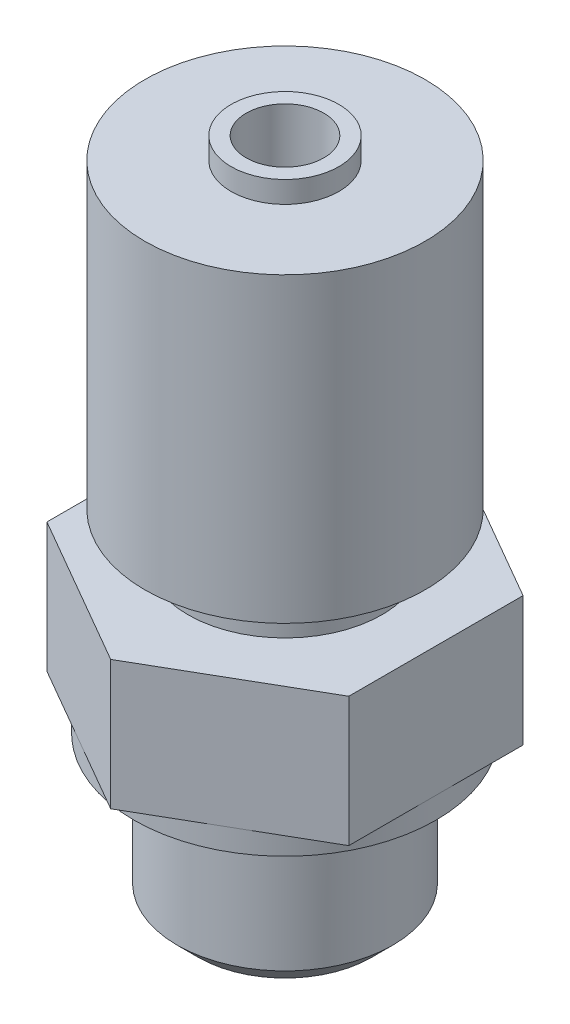
ISO-10303-21;
HEADER;
FILE_DESCRIPTION(('STEP AP214'),'2;1');
FILE_NAME('part.step','',(''),(''),'','','');
FILE_SCHEMA(('AUTOMOTIVE_DESIGN { 1 0 10303 214 1 1 1 1 }'));
ENDSEC;
DATA;
#1=APPLICATION_CONTEXT('core data for automotive mechanical design processes');
#2=APPLICATION_PROTOCOL_DEFINITION('international standard','automotive_design',2000,#1);
#3=PRODUCT_CONTEXT('',#1,'mechanical');
#4=PRODUCT('Part','Part','',(#3));
#5=PRODUCT_RELATED_PRODUCT_CATEGORY('part','',(#4));
#6=PRODUCT_DEFINITION_FORMATION('','',#4);
#7=PRODUCT_DEFINITION_CONTEXT('part definition',#1,'design');
#8=PRODUCT_DEFINITION('design','',#6,#7);
#9=PRODUCT_DEFINITION_SHAPE('','',#8);
#10=(LENGTH_UNIT() NAMED_UNIT(*) SI_UNIT(.MILLI.,.METRE.));
#11=(NAMED_UNIT(*) PLANE_ANGLE_UNIT() SI_UNIT($,.RADIAN.));
#12=(NAMED_UNIT(*) SI_UNIT($,.STERADIAN.) SOLID_ANGLE_UNIT());
#13=UNCERTAINTY_MEASURE_WITH_UNIT(LENGTH_MEASURE(1.E-05),#10,'distance_accuracy_value','');
#14=(GEOMETRIC_REPRESENTATION_CONTEXT(3) GLOBAL_UNCERTAINTY_ASSIGNED_CONTEXT((#13)) GLOBAL_UNIT_ASSIGNED_CONTEXT((#10,
#11,#12)) REPRESENTATION_CONTEXT('',''));
#15=CARTESIAN_POINT('',(0.,0.,0.));
#16=DIRECTION('',(0.,0.,1.));
#17=DIRECTION('',(1.,0.,0.));
#18=AXIS2_PLACEMENT_3D('',#15,#16,#17);
#19=CARTESIAN_POINT('',(0.,15.5,0.));
#20=DIRECTION('',(0.,1.,0.));
#21=DIRECTION('',(0.,0.,1.));
#22=AXIS2_PLACEMENT_3D('',#19,#20,#21);
#23=CYLINDRICAL_SURFACE('',#22,1.25);
#24=CARTESIAN_POINT('',(0.,15.5,0.));
#25=DIRECTION('',(0.,1.,0.));
#26=DIRECTION('',(0.,0.,1.));
#27=AXIS2_PLACEMENT_3D('',#24,#25,#26);
#28=CIRCLE('',#27,1.25);
#29=CARTESIAN_POINT('',(0.,15.5,1.25));
#30=VERTEX_POINT('',#29);
#31=EDGE_CURVE('E390',#30,#30,#28,.T.);
#32=ORIENTED_EDGE('',*,*,#31,.F.);
#33=EDGE_LOOP('',(#32));
#34=FACE_BOUND('',#33,.T.);
#35=CARTESIAN_POINT('',(0.,15.,0.));
#36=DIRECTION('',(0.,1.,0.));
#37=DIRECTION('',(0.,0.,1.));
#38=AXIS2_PLACEMENT_3D('',#35,#36,#37);
#39=CIRCLE('',#38,1.25);
#40=CARTESIAN_POINT('',(0.,15.,1.25));
#41=VERTEX_POINT('',#40);
#42=EDGE_CURVE('E19',#41,#41,#39,.F.);
#43=ORIENTED_EDGE('',*,*,#42,.F.);
#44=EDGE_LOOP('',(#43));
#45=FACE_BOUND('',#44,.T.);
#46=ADVANCED_FACE('F16',(#34,#45),#23,.T.);
#47=CARTESIAN_POINT('',(-3.25,15.,3.28900212066227));
#48=DIRECTION('',(0.,1.,0.));
#49=DIRECTION('',(1.,0.,0.));
#50=AXIS2_PLACEMENT_3D('',#47,#48,#49);
#51=PLANE('',#50);
#52=ORIENTED_EDGE('',*,*,#42,.T.);
#53=EDGE_LOOP('',(#52));
#54=FACE_BOUND('',#53,.T.);
#55=CARTESIAN_POINT('',(0.,15.,0.));
#56=DIRECTION('',(0.,1.,0.));
#57=DIRECTION('',(0.,0.,1.));
#58=AXIS2_PLACEMENT_3D('',#55,#56,#57);
#59=CIRCLE('',#58,3.25);
#60=CARTESIAN_POINT('',(0.,15.,3.25));
#61=VERTEX_POINT('',#60);
#62=EDGE_CURVE('E388',#61,#61,#59,.F.);
#63=ORIENTED_EDGE('',*,*,#62,.F.);
#64=EDGE_LOOP('',(#63));
#65=FACE_BOUND('',#64,.T.);
#66=ADVANCED_FACE('F256',(#54,#65),#51,.T.);
#67=CARTESIAN_POINT('',(-1.25,15.5,1.26500421623099));
#68=DIRECTION('',(0.,1.,0.));
#69=DIRECTION('',(1.,0.,0.));
#70=AXIS2_PLACEMENT_3D('',#67,#68,#69);
#71=PLANE('',#70);
#72=CARTESIAN_POINT('',(0.,15.5,0.));
#73=DIRECTION('',(0.,1.,0.));
#74=DIRECTION('',(0.,0.,1.));
#75=AXIS2_PLACEMENT_3D('',#72,#73,#74);
#76=CIRCLE('',#75,0.9);
#77=CARTESIAN_POINT('',(0.,15.5,0.9));
#78=VERTEX_POINT('',#77);
#79=EDGE_CURVE('E385',#78,#78,#76,.T.);
#80=ORIENTED_EDGE('',*,*,#79,.F.);
#81=EDGE_LOOP('',(#80));
#82=FACE_BOUND('',#81,.T.);
#83=ORIENTED_EDGE('',*,*,#31,.T.);
#84=EDGE_LOOP('',(#83));
#85=FACE_BOUND('',#84,.T.);
#86=ADVANCED_FACE('F253',(#82,#85),#71,.T.);
#87=CARTESIAN_POINT('',(0.,15.,0.));
#88=DIRECTION('',(0.,1.,0.));
#89=DIRECTION('',(0.,0.,1.));
#90=AXIS2_PLACEMENT_3D('',#87,#88,#89);
#91=CYLINDRICAL_SURFACE('',#90,3.25);
#92=ORIENTED_EDGE('',*,*,#62,.T.);
#93=EDGE_LOOP('',(#92));
#94=FACE_BOUND('',#93,.T.);
#95=CARTESIAN_POINT('',(0.,8.,0.));
#96=DIRECTION('',(0.,1.,0.));
#97=DIRECTION('',(0.,0.,1.));
#98=AXIS2_PLACEMENT_3D('',#95,#96,#97);
#99=CIRCLE('',#98,3.25);
#100=CARTESIAN_POINT('',(0.,8.,3.25));
#101=VERTEX_POINT('',#100);
#102=EDGE_CURVE('E382',#101,#101,#99,.F.);
#103=ORIENTED_EDGE('',*,*,#102,.F.);
#104=EDGE_LOOP('',(#103));
#105=FACE_BOUND('',#104,.T.);
#106=ADVANCED_FACE('F249',(#94,#105),#91,.T.);
#107=CARTESIAN_POINT('',(0.,0.,0.));
#108=DIRECTION('',(0.,1.,0.));
#109=DIRECTION('',(0.,0.,1.));
#110=AXIS2_PLACEMENT_3D('',#107,#108,#109);
#111=CYLINDRICAL_SURFACE('',#110,0.9);
#112=CARTESIAN_POINT('',(0.,0.,0.));
#113=DIRECTION('',(0.,1.,0.));
#114=DIRECTION('',(0.,0.,1.));
#115=AXIS2_PLACEMENT_3D('',#112,#113,#114);
#116=CIRCLE('',#115,0.9);
#117=CARTESIAN_POINT('',(0.,0.,0.9));
#118=VERTEX_POINT('',#117);
#119=EDGE_CURVE('E379',#118,#118,#116,.T.);
#120=ORIENTED_EDGE('',*,*,#119,.F.);
#121=EDGE_LOOP('',(#120));
#122=FACE_BOUND('',#121,.T.);
#123=ORIENTED_EDGE('',*,*,#79,.T.);
#124=EDGE_LOOP('',(#123));
#125=FACE_BOUND('',#124,.T.);
#126=ADVANCED_FACE('F245',(#122,#125),#111,.F.);
#127=CARTESIAN_POINT('',(3.25,8.,3.289002120661));
#128=DIRECTION('',(0.,-1.,0.));
#129=DIRECTION('',(-1.,0.,0.));
#130=AXIS2_PLACEMENT_3D('',#127,#128,#129);
#131=PLANE('',#130);
#132=CARTESIAN_POINT('',(0.,8.,0.));
#133=DIRECTION('',(0.,1.,0.));
#134=DIRECTION('',(0.,0.,1.));
#135=AXIS2_PLACEMENT_3D('',#132,#133,#134);
#136=CIRCLE('',#135,2.25);
#137=CARTESIAN_POINT('',(0.,8.,2.25));
#138=VERTEX_POINT('',#137);
#139=EDGE_CURVE('E376',#138,#138,#136,.F.);
#140=ORIENTED_EDGE('',*,*,#139,.F.);
#141=EDGE_LOOP('',(#140));
#142=FACE_BOUND('',#141,.T.);
#143=ORIENTED_EDGE('',*,*,#102,.T.);
#144=EDGE_LOOP('',(#143));
#145=FACE_BOUND('',#144,.T.);
#146=ADVANCED_FACE('F241',(#142,#145),#131,.T.);
#147=CARTESIAN_POINT('',(2.01,0.,2.03412212055392));
#148=DIRECTION('',(0.,-1.,0.));
#149=DIRECTION('',(-1.,0.,0.));
#150=AXIS2_PLACEMENT_3D('',#147,#148,#149);
#151=PLANE('',#150);
#152=ORIENTED_EDGE('',*,*,#119,.T.);
#153=EDGE_LOOP('',(#152));
#154=FACE_BOUND('',#153,.T.);
#155=CARTESIAN_POINT('',(0.,0.,0.));
#156=DIRECTION('',(0.,1.,0.));
#157=DIRECTION('',(0.,0.,1.));
#158=AXIS2_PLACEMENT_3D('',#155,#156,#157);
#159=CIRCLE('',#158,2.01);
#160=CARTESIAN_POINT('',(0.,0.,2.01));
#161=VERTEX_POINT('',#160);
#162=EDGE_CURVE('E371',#161,#161,#159,.T.);
#163=ORIENTED_EDGE('',*,*,#162,.F.);
#164=EDGE_LOOP('',(#163));
#165=FACE_BOUND('',#164,.T.);
#166=ADVANCED_FACE('F237',(#154,#165),#151,.T.);
#167=CARTESIAN_POINT('',(0.,8.,0.));
#168=DIRECTION('',(0.,1.,0.));
#169=DIRECTION('',(0.,0.,1.));
#170=AXIS2_PLACEMENT_3D('',#167,#168,#169);
#171=CYLINDRICAL_SURFACE('',#170,2.25);
#172=CARTESIAN_POINT('',(0.,7.,0.));
#173=DIRECTION('',(0.,1.,0.));
#174=DIRECTION('',(0.,0.,1.));
#175=AXIS2_PLACEMENT_3D('',#172,#173,#174);
#176=CIRCLE('',#175,2.25);
#177=CARTESIAN_POINT('',(0.,7.,2.25));
#178=VERTEX_POINT('',#177);
#179=EDGE_CURVE('E184',#178,#178,#176,.F.);
#180=ORIENTED_EDGE('',*,*,#179,.F.);
#181=EDGE_LOOP('',(#180));
#182=FACE_BOUND('',#181,.T.);
#183=ORIENTED_EDGE('',*,*,#139,.T.);
#184=EDGE_LOOP('',(#183));
#185=FACE_BOUND('',#184,.T.);
#186=ADVANCED_FACE('F232',(#182,#185),#171,.T.);
#187=CARTESIAN_POINT('',(-1.75,4.,4.0515555140382));
#188=CARTESIAN_POINT('',(-1.75,4.,4.04145188432738));
#189=CARTESIAN_POINT('',(-1.75,4.,3.03108891324553));
#190=B_SPLINE_CURVE_WITH_KNOTS('',1,(#187,#188,#189),.UNSPECIFIED.,.F.,.F.,(2,1,2),(-0.01,0.,
1.),.UNSPECIFIED.);
#191=DIRECTION('',(1.,0.,0.));
#192=VECTOR('',#191,1.);
#193=SURFACE_OF_LINEAR_EXTRUSION('',#190,#192);
#194=DIRECTION('',(0.866025403784439,0.,-0.5));
#195=VECTOR('',#194,1.);
#196=CARTESIAN_POINT('',(1.75,4.,3.03108891324554));
#197=LINE('',#196,#195);
#198=CARTESIAN_POINT('',(0.,4.,4.04145188432738));
#199=VERTEX_POINT('',#198);
#200=CARTESIAN_POINT('',(1.7503904492022,4.,3.03086348729354));
#201=VERTEX_POINT('',#200);
#202=EDGE_CURVE('E221',#199,#201,#197,.T.);
#203=ORIENTED_EDGE('',*,*,#202,.F.);
#204=DIRECTION('',(0.866025403784439,0.,0.5));
#205=VECTOR('',#204,1.);
#206=CARTESIAN_POINT('',(-1.75,4.,3.03108891324554));
#207=LINE('',#206,#205);
#208=CARTESIAN_POINT('',(-1.75039045907652,4.,3.03086341451837));
#209=VERTEX_POINT('',#208);
#210=EDGE_CURVE('E370',#209,#199,#207,.T.);
#211=ORIENTED_EDGE('',*,*,#210,.F.);
#212=CARTESIAN_POINT('',(0.,4.,0.));
#213=DIRECTION('',(0.,1.,0.));
#214=DIRECTION('',(0.,0.,1.));
#215=AXIS2_PLACEMENT_3D('',#212,#213,#214);
#216=CIRCLE('',#215,3.5);
#217=EDGE_CURVE('E94',#201,#209,#216,.F.);
#218=ORIENTED_EDGE('',*,*,#217,.F.);
#219=EDGE_LOOP('',(#203,#211,#218));
#220=FACE_BOUND('',#219,.T.);
#221=ADVANCED_FACE('F227',(#220),#193,.T.);
#222=CARTESIAN_POINT('',(0.,0.,0.));
#223=DIRECTION('',(0.,1.,0.));
#224=DIRECTION('',(0.,0.,1.));
#225=AXIS2_PLACEMENT_3D('',#222,#223,#224);
#226=CONICAL_SURFACE('',#225,2.01,0.785398163397449);
#227=CARTESIAN_POINT('',(0.,0.49,0.));
#228=DIRECTION('',(0.,1.,0.));
#229=DIRECTION('',(1.,0.,0.));
#230=AXIS2_PLACEMENT_3D('',#227,#228,#229);
#231=CIRCLE('',#230,2.5);
#232=CARTESIAN_POINT('',(2.5,0.49,0.));
#233=VERTEX_POINT('',#232);
#234=EDGE_CURVE('E208',#233,#233,#231,.T.);
#235=ORIENTED_EDGE('',*,*,#234,.F.);
#236=EDGE_LOOP('',(#235));
#237=FACE_BOUND('',#236,.T.);
#238=ORIENTED_EDGE('',*,*,#162,.T.);
#239=EDGE_LOOP('',(#238));
#240=FACE_BOUND('',#239,.T.);
#241=ADVANCED_FACE('F231',(#237,#240),#226,.T.);
#242=CARTESIAN_POINT('',(-3.5,4.,3.03108891324554));
#243=DIRECTION('',(0.,-1.,0.));
#244=DIRECTION('',(0.,0.,-1.));
#245=AXIS2_PLACEMENT_3D('',#242,#243,#244);
#246=PLANE('',#245);
#247=DIRECTION('',(0.866025403784438,0.,0.5));
#248=VECTOR('',#247,1.);
#249=CARTESIAN_POINT('',(-3.5,4.,2.02072594216369));
#250=LINE('',#249,#248);
#251=CARTESIAN_POINT('',(-3.5,4.,2.02072594216369));
#252=VERTEX_POINT('',#251);
#253=EDGE_CURVE('E367',#252,#209,#250,.T.);
#254=ORIENTED_EDGE('',*,*,#253,.F.);
#255=DIRECTION('',(0.,0.,1.));
#256=VECTOR('',#255,1.);
#257=CARTESIAN_POINT('',(-3.5,4.,0.));
#258=LINE('',#257,#256);
#259=CARTESIAN_POINT('',(-3.5,4.,0.));
#260=VERTEX_POINT('',#259);
#261=EDGE_CURVE('E143',#260,#252,#258,.T.);
#262=ORIENTED_EDGE('',*,*,#261,.F.);
#263=CARTESIAN_POINT('',(0.,4.,0.));
#264=DIRECTION('',(0.,1.,0.));
#265=DIRECTION('',(0.,0.,1.));
#266=AXIS2_PLACEMENT_3D('',#263,#264,#265);
#267=CIRCLE('',#266,3.5);
#268=EDGE_CURVE('E216',#209,#260,#267,.F.);
#269=ORIENTED_EDGE('',*,*,#268,.F.);
#270=EDGE_LOOP('',(#254,#262,#269));
#271=FACE_BOUND('',#270,.T.);
#272=ADVANCED_FACE('F407',(#271),#246,.T.);
#273=CARTESIAN_POINT('',(-3.5,4.,2.02072594216369));
#274=DIRECTION('',(-0.5,0.,0.866025403784438));
#275=DIRECTION('',(0.866025403784438,0.,0.5));
#276=AXIS2_PLACEMENT_3D('',#273,#274,#275);
#277=PLANE('',#276);
#278=ORIENTED_EDGE('',*,*,#210,.T.);
#279=DIRECTION('',(0.,1.,0.));
#280=VECTOR('',#279,1.);
#281=CARTESIAN_POINT('',(0.,4.,4.04145188432738));
#282=LINE('',#281,#280);
#283=CARTESIAN_POINT('',(-8.33414995002335E-08,7.,4.04145183621014));
#284=VERTEX_POINT('',#283);
#285=EDGE_CURVE('E183',#284,#199,#282,.F.);
#286=ORIENTED_EDGE('',*,*,#285,.F.);
#287=CARTESIAN_POINT('',(-3.5,7.,2.02072594216369));
#288=CARTESIAN_POINT('',(-3.35416666666667,7.,2.10492285642051));
#289=CARTESIAN_POINT('',(-3.20833333333333,7.,2.18911977067733));
#290=CARTESIAN_POINT('',(-2.91666666666667,7.,2.35751359919097));
#291=CARTESIAN_POINT('',(-2.77083333333333,7.,2.44171051344779));
#292=CARTESIAN_POINT('',(-2.47916666666667,7.,2.61010434196143));
#293=CARTESIAN_POINT('',(-2.33333333333333,7.,2.69430125621825));
#294=CARTESIAN_POINT('',(-2.04166666666667,7.,2.86269508473189));
#295=CARTESIAN_POINT('',(-1.89583333333333,7.,2.94689199898872));
#296=CARTESIAN_POINT('',(-1.60416666666667,7.,3.11528582750236));
#297=CARTESIAN_POINT('',(-1.45833333333333,7.,3.19948274175918));
#298=CARTESIAN_POINT('',(-1.16666666666667,7.,3.36787657027282));
#299=CARTESIAN_POINT('',(-1.02083333333333,7.,3.45207348452964));
#300=CARTESIAN_POINT('',(-0.729166666666667,7.,3.62046731304328));
#301=CARTESIAN_POINT('',(-0.583333333333333,7.,3.7046642273001));
#302=CARTESIAN_POINT('',(-0.291666666666667,7.,3.87305805581374));
#303=CARTESIAN_POINT('',(-0.145833333333333,7.,3.95725497007056));
#304=CARTESIAN_POINT('',(0.,7.,4.04145188432738));
#305=B_SPLINE_CURVE_WITH_KNOTS('',3,(#287,#288,#289,#290,#291,#292,#293,#294,#295,#296,#297,
#298,#299,#300,#301,#302,#303,#304),.UNSPECIFIED.,.F.,.F.,(4,2,2,2,2,2,2,2,4),(0.,
0.505181485540922,1.01036297108184,1.51554445662277,2.02072594216369,2.52590742770461,
3.03108891324554,3.53627039878646,4.04145188432738),.UNSPECIFIED.);
#306=CARTESIAN_POINT('',(-3.5,7.,2.02072594216369));
#307=VERTEX_POINT('',#306);
#308=EDGE_CURVE('E206',#307,#284,#305,.T.);
#309=ORIENTED_EDGE('',*,*,#308,.F.);
#310=DIRECTION('',(0.,1.,0.));
#311=VECTOR('',#310,1.);
#312=CARTESIAN_POINT('',(-3.5,4.,2.02072594216369));
#313=LINE('',#312,#311);
#314=EDGE_CURVE('E146',#252,#307,#313,.T.);
#315=ORIENTED_EDGE('',*,*,#314,.F.);
#316=ORIENTED_EDGE('',*,*,#253,.T.);
#317=EDGE_LOOP('',(#278,#286,#309,#315,#316));
#318=FACE_BOUND('',#317,.T.);
#319=ADVANCED_FACE('F412',(#318),#277,.T.);
#320=CARTESIAN_POINT('',(-3.5,7.,-4.04145188432738));
#321=DIRECTION('',(0.,1.,0.));
#322=DIRECTION('',(0.,0.,1.));
#323=AXIS2_PLACEMENT_3D('',#320,#321,#322);
#324=PLANE('',#323);
#325=ORIENTED_EDGE('',*,*,#179,.T.);
#326=EDGE_LOOP('',(#325));
#327=FACE_BOUND('',#326,.T.);
#328=DIRECTION('',(0.,0.,1.));
#329=VECTOR('',#328,1.);
#330=CARTESIAN_POINT('',(3.5,7.,0.));
#331=LINE('',#330,#329);
#332=CARTESIAN_POINT('',(3.5,7.,-2.02072594216369));
#333=VERTEX_POINT('',#332);
#334=CARTESIAN_POINT('',(3.5,7.,2.02072594216369));
#335=VERTEX_POINT('',#334);
#336=EDGE_CURVE('E119',#333,#335,#331,.T.);
#337=ORIENTED_EDGE('',*,*,#336,.F.);
#338=DIRECTION('',(0.866025403784439,0.,0.5));
#339=VECTOR('',#338,1.);
#340=CARTESIAN_POINT('',(1.75,7.,-3.03108891324554));
#341=LINE('',#340,#339);
#342=CARTESIAN_POINT('',(0.,7.,-4.04145188432738));
#343=VERTEX_POINT('',#342);
#344=EDGE_CURVE('E134',#343,#333,#341,.T.);
#345=ORIENTED_EDGE('',*,*,#344,.F.);
#346=DIRECTION('',(0.866025403784439,0.,-0.5));
#347=VECTOR('',#346,1.);
#348=CARTESIAN_POINT('',(-1.75,7.,-3.03108891324554));
#349=LINE('',#348,#347);
#350=CARTESIAN_POINT('',(-3.5,7.,-2.02072594216369));
#351=VERTEX_POINT('',#350);
#352=EDGE_CURVE('E140',#351,#343,#349,.T.);
#353=ORIENTED_EDGE('',*,*,#352,.F.);
#354=DIRECTION('',(0.,0.,-1.));
#355=VECTOR('',#354,1.);
#356=CARTESIAN_POINT('',(-3.5,7.,0.));
#357=LINE('',#356,#355);
#358=EDGE_CURVE('E147',#307,#351,#357,.T.);
#359=ORIENTED_EDGE('',*,*,#358,.F.);
#360=ORIENTED_EDGE('',*,*,#308,.T.);
#361=DIRECTION('',(-0.866025403784439,0.,0.5));
#362=VECTOR('',#361,1.);
#363=CARTESIAN_POINT('',(1.75,7.,3.03108891324554));
#364=LINE('',#363,#362);
#365=EDGE_CURVE('E180',#335,#284,#364,.T.);
#366=ORIENTED_EDGE('',*,*,#365,.F.);
#367=EDGE_LOOP('',(#337,#345,#353,#359,#360,#366));
#368=FACE_BOUND('',#367,.T.);
#369=ADVANCED_FACE('F199',(#327,#368),#324,.T.);
#370=CARTESIAN_POINT('',(0.,4.,4.04145188432738));
#371=DIRECTION('',(0.5,0.,0.866025403784438));
#372=DIRECTION('',(0.866025403784438,0.,-0.5));
#373=AXIS2_PLACEMENT_3D('',#370,#371,#372);
#374=PLANE('',#373);
#375=CARTESIAN_POINT('',(3.5,4.,2.02072594216369));
#376=CARTESIAN_POINT('',(3.42708333333333,4.,2.0628243992921));
#377=CARTESIAN_POINT('',(3.35416666666667,4.,2.10492285642051));
#378=CARTESIAN_POINT('',(3.20833333333333,4.,2.18911977067733));
#379=CARTESIAN_POINT('',(3.13541666666667,4.,2.23121822780574));
#380=CARTESIAN_POINT('',(2.98958333333333,4.,2.31541514206256));
#381=CARTESIAN_POINT('',(2.91666666666667,4.,2.35751359919097));
#382=CARTESIAN_POINT('',(2.77083333333333,4.,2.44171051344779));
#383=CARTESIAN_POINT('',(2.69791666666667,4.,2.4838089705762));
#384=CARTESIAN_POINT('',(2.55208333333333,4.,2.56800588483302));
#385=CARTESIAN_POINT('',(2.47916666666667,4.,2.61010434196144));
#386=CARTESIAN_POINT('',(2.33333333333333,4.,2.69430125621826));
#387=CARTESIAN_POINT('',(2.26041666666667,4.,2.73639971334667));
#388=CARTESIAN_POINT('',(2.11458333333333,4.,2.82059662760349));
#389=CARTESIAN_POINT('',(2.04166666666667,4.,2.8626950847319));
#390=CARTESIAN_POINT('',(1.89583333333333,4.,2.94689199898872));
#391=CARTESIAN_POINT('',(1.82291666666667,4.,2.98899045611713));
#392=CARTESIAN_POINT('',(1.75,4.,3.03108891324554));
#393=B_SPLINE_CURVE_WITH_KNOTS('',3,(#375,#376,#377,#378,#379,#380,#381,#382,#383,#384,#385,
#386,#387,#388,#389,#390,#391,#392),.UNSPECIFIED.,.F.,.F.,(4,2,2,2,2,2,2,2,4),(0.,
0.252590742770461,0.505181485540923,0.757772228311385,1.01036297108185,1.26295371385231,
1.51554445662277,1.76813519939323,2.02072594216369),.UNSPECIFIED.);
#394=CARTESIAN_POINT('',(3.5,4.,2.02072594216369));
#395=VERTEX_POINT('',#394);
#396=EDGE_CURVE('E90',#395,#201,#393,.T.);
#397=ORIENTED_EDGE('',*,*,#396,.F.);
#398=DIRECTION('',(0.,1.,0.));
#399=VECTOR('',#398,1.);
#400=CARTESIAN_POINT('',(3.5,4.,2.02072594216369));
#401=LINE('',#400,#399);
#402=EDGE_CURVE('E114',#335,#395,#401,.F.);
#403=ORIENTED_EDGE('',*,*,#402,.F.);
#404=ORIENTED_EDGE('',*,*,#365,.T.);
#405=ORIENTED_EDGE('',*,*,#285,.T.);
#406=ORIENTED_EDGE('',*,*,#202,.T.);
#407=EDGE_LOOP('',(#397,#403,#404,#405,#406));
#408=FACE_BOUND('',#407,.T.);
#409=ADVANCED_FACE('F198',(#408),#374,.T.);
#410=CARTESIAN_POINT('',(1.74028555255367,4.,3.03108891324554));
#411=DIRECTION('',(0.,-1.,0.));
#412=DIRECTION('',(0.,0.,-1.));
#413=AXIS2_PLACEMENT_3D('',#410,#411,#412);
#414=PLANE('',#413);
#415=DIRECTION('',(0.,0.,-1.));
#416=VECTOR('',#415,1.);
#417=CARTESIAN_POINT('',(3.5,4.,0.));
#418=LINE('',#417,#416);
#419=CARTESIAN_POINT('',(3.5,4.,0.));
#420=VERTEX_POINT('',#419);
#421=EDGE_CURVE('E88',#395,#420,#418,.T.);
#422=ORIENTED_EDGE('',*,*,#421,.F.);
#423=ORIENTED_EDGE('',*,*,#396,.T.);
#424=CARTESIAN_POINT('',(0.,4.,0.));
#425=DIRECTION('',(0.,1.,0.));
#426=DIRECTION('',(0.,0.,1.));
#427=AXIS2_PLACEMENT_3D('',#424,#425,#426);
#428=CIRCLE('',#427,3.5);
#429=EDGE_CURVE('E85',#420,#201,#428,.F.);
#430=ORIENTED_EDGE('',*,*,#429,.F.);
#431=EDGE_LOOP('',(#422,#423,#430));
#432=FACE_BOUND('',#431,.T.);
#433=ADVANCED_FACE('F86',(#432),#414,.T.);
#434=CARTESIAN_POINT('',(0.,3.5,0.));
#435=DIRECTION('',(0.,1.,0.));
#436=DIRECTION('',(0.,0.,1.));
#437=AXIS2_PLACEMENT_3D('',#434,#435,#436);
#438=CYLINDRICAL_SURFACE('',#437,2.5);
#439=CARTESIAN_POINT('',(0.,3.5,0.));
#440=DIRECTION('',(0.,1.,0.));
#441=DIRECTION('',(0.,0.,1.));
#442=AXIS2_PLACEMENT_3D('',#439,#440,#441);
#443=CIRCLE('',#442,2.5);
#444=CARTESIAN_POINT('',(0.,3.5,2.5));
#445=VERTEX_POINT('',#444);
#446=EDGE_CURVE('E117',#445,#445,#443,.T.);
#447=ORIENTED_EDGE('',*,*,#446,.F.);
#448=EDGE_LOOP('',(#447));
#449=FACE_BOUND('',#448,.T.);
#450=ORIENTED_EDGE('',*,*,#234,.T.);
#451=EDGE_LOOP('',(#450));
#452=FACE_BOUND('',#451,.T.);
#453=ADVANCED_FACE('F167',(#449,#452),#438,.T.);
#454=CARTESIAN_POINT('',(-3.5,4.,-2.02072594216369));
#455=DIRECTION('',(-1.,0.,0.));
#456=DIRECTION('',(0.,0.,1.));
#457=AXIS2_PLACEMENT_3D('',#454,#455,#456);
#458=PLANE('',#457);
#459=ORIENTED_EDGE('',*,*,#261,.T.);
#460=ORIENTED_EDGE('',*,*,#314,.T.);
#461=ORIENTED_EDGE('',*,*,#358,.T.);
#462=DIRECTION('',(0.,1.,0.));
#463=VECTOR('',#462,1.);
#464=CARTESIAN_POINT('',(-3.5,4.,-2.02072594216369));
#465=LINE('',#464,#463);
#466=CARTESIAN_POINT('',(-3.5,4.,-2.02072594216369));
#467=VERTEX_POINT('',#466);
#468=EDGE_CURVE('E137',#467,#351,#465,.T.);
#469=ORIENTED_EDGE('',*,*,#468,.F.);
#470=DIRECTION('',(0.,0.,-1.));
#471=VECTOR('',#470,1.);
#472=CARTESIAN_POINT('',(-3.5,4.,-1.51554445662277));
#473=LINE('',#472,#471);
#474=EDGE_CURVE('E331',#260,#467,#473,.T.);
#475=ORIENTED_EDGE('',*,*,#474,.F.);
#476=EDGE_LOOP('',(#459,#460,#461,#469,#475));
#477=FACE_BOUND('',#476,.T.);
#478=ADVANCED_FACE('F417',(#477),#458,.T.);
#479=CARTESIAN_POINT('',(0.,4.,-4.04145188432738));
#480=DIRECTION('',(-0.5,0.,-0.866025403784438));
#481=DIRECTION('',(-0.866025403784438,0.,0.5));
#482=AXIS2_PLACEMENT_3D('',#479,#480,#481);
#483=PLANE('',#482);
#484=CARTESIAN_POINT('',(-3.5,4.,-2.02072594216369));
#485=CARTESIAN_POINT('',(-3.42708333333333,4.,-2.0628243992921));
#486=CARTESIAN_POINT('',(-3.35416666666667,4.,-2.10492285642051));
#487=CARTESIAN_POINT('',(-3.20833333333333,4.,-2.18911977067733));
#488=CARTESIAN_POINT('',(-3.13541666666667,4.,-2.23121822780574));
#489=CARTESIAN_POINT('',(-2.98958333333333,4.,-2.31541514206256));
#490=CARTESIAN_POINT('',(-2.91666666666667,4.,-2.35751359919097));
#491=CARTESIAN_POINT('',(-2.77083333333333,4.,-2.44171051344779));
#492=CARTESIAN_POINT('',(-2.69791666666667,4.,-2.4838089705762));
#493=CARTESIAN_POINT('',(-2.55208333333333,4.,-2.56800588483303));
#494=CARTESIAN_POINT('',(-2.47916666666667,4.,-2.61010434196144));
#495=CARTESIAN_POINT('',(-2.33333333333333,4.,-2.69430125621826));
#496=CARTESIAN_POINT('',(-2.26041666666667,4.,-2.73639971334667));
#497=CARTESIAN_POINT('',(-2.11458333333333,4.,-2.82059662760349));
#498=CARTESIAN_POINT('',(-2.04166666666667,4.,-2.8626950847319));
#499=CARTESIAN_POINT('',(-1.89583333333333,4.,-2.94689199898872));
#500=CARTESIAN_POINT('',(-1.82291666666667,4.,-2.98899045611713));
#501=CARTESIAN_POINT('',(-1.75,4.,-3.03108891324554));
#502=B_SPLINE_CURVE_WITH_KNOTS('',3,(#484,#485,#486,#487,#488,#489,#490,#491,#492,#493,#494,
#495,#496,#497,#498,#499,#500,#501),.UNSPECIFIED.,.F.,.F.,(4,2,2,2,2,2,2,2,4),(0.,
0.252590742770461,0.505181485540923,0.757772228311385,1.01036297108185,1.26295371385231,
1.51554445662277,1.76813519939323,2.02072594216369),.UNSPECIFIED.);
#503=CARTESIAN_POINT('',(-1.75039044920207,4.,-3.03086348729362));
#504=VERTEX_POINT('',#503);
#505=EDGE_CURVE('E326',#467,#504,#502,.T.);
#506=ORIENTED_EDGE('',*,*,#505,.F.);
#507=ORIENTED_EDGE('',*,*,#468,.T.);
#508=ORIENTED_EDGE('',*,*,#352,.T.);
#509=DIRECTION('',(0.,1.,0.));
#510=VECTOR('',#509,1.);
#511=CARTESIAN_POINT('',(0.,4.,-4.04145188432738));
#512=LINE('',#511,#510);
#513=CARTESIAN_POINT('',(-1.66666921872412E-07,4.,-4.04145178810219));
#514=VERTEX_POINT('',#513);
#515=EDGE_CURVE('E131',#514,#343,#512,.T.);
#516=ORIENTED_EDGE('',*,*,#515,.F.);
#517=CARTESIAN_POINT('',(-1.75,4.,-3.03108891324553));
#518=CARTESIAN_POINT('',(-1.67708333333333,4.,-3.07318737037394));
#519=CARTESIAN_POINT('',(-1.60416666666667,4.,-3.11528582750235));
#520=CARTESIAN_POINT('',(-1.45833333333333,4.,-3.19948274175917));
#521=CARTESIAN_POINT('',(-1.38541666666667,4.,-3.24158119888758));
#522=CARTESIAN_POINT('',(-1.23958333333333,4.,-3.3257781131444));
#523=CARTESIAN_POINT('',(-1.16666666666667,4.,-3.36787657027281));
#524=CARTESIAN_POINT('',(-1.02083333333333,4.,-3.45207348452963));
#525=CARTESIAN_POINT('',(-0.947916666666667,4.,-3.49417194165805));
#526=CARTESIAN_POINT('',(-0.802083333333334,4.,-3.57836885591487));
#527=CARTESIAN_POINT('',(-0.729166666666667,4.,-3.62046731304328));
#528=CARTESIAN_POINT('',(-0.583333333333333,4.,-3.7046642273001));
#529=CARTESIAN_POINT('',(-0.510416666666667,4.,-3.74676268442851));
#530=CARTESIAN_POINT('',(-0.364583333333333,4.,-3.83095959868533));
#531=CARTESIAN_POINT('',(-0.291666666666667,4.,-3.87305805581374));
#532=CARTESIAN_POINT('',(-0.145833333333333,4.,-3.95725497007056));
#533=CARTESIAN_POINT('',(-0.0729166666666667,4.,-3.99935342719897));
#534=CARTESIAN_POINT('',(0.,4.,-4.04145188432738));
#535=B_SPLINE_CURVE_WITH_KNOTS('',3,(#517,#518,#519,#520,#521,#522,#523,#524,#525,#526,#527,
#528,#529,#530,#531,#532,#533,#534),.UNSPECIFIED.,.F.,.F.,(4,2,2,2,2,2,2,2,4),(0.,
0.252590742770462,0.505181485540923,0.757772228311385,1.01036297108185,1.26295371385231,
1.51554445662277,1.76813519939323,2.02072594216369),.UNSPECIFIED.);
#536=EDGE_CURVE('E324',#504,#514,#535,.T.);
#537=ORIENTED_EDGE('',*,*,#536,.F.);
#538=EDGE_LOOP('',(#506,#507,#508,#516,#537));
#539=FACE_BOUND('',#538,.T.);
#540=ADVANCED_FACE('F423',(#539),#483,.T.);
#541=CARTESIAN_POINT('',(3.5,4.,-2.02072594216369));
#542=DIRECTION('',(0.5,0.,-0.866025403784438));
#543=DIRECTION('',(-0.866025403784438,0.,-0.5));
#544=AXIS2_PLACEMENT_3D('',#541,#542,#543);
#545=PLANE('',#544);
#546=CARTESIAN_POINT('',(0.,4.,-4.04145188432738));
#547=CARTESIAN_POINT('',(0.0729166666666668,4.,-3.99935342719897));
#548=CARTESIAN_POINT('',(0.145833333333334,4.,-3.95725497007056));
#549=CARTESIAN_POINT('',(0.291666666666667,4.,-3.87305805581374));
#550=CARTESIAN_POINT('',(0.364583333333333,4.,-3.83095959868533));
#551=CARTESIAN_POINT('',(0.510416666666667,4.,-3.74676268442851));
#552=CARTESIAN_POINT('',(0.583333333333333,4.,-3.7046642273001));
#553=CARTESIAN_POINT('',(0.729166666666667,4.,-3.62046731304328));
#554=CARTESIAN_POINT('',(0.802083333333334,4.,-3.57836885591487));
#555=CARTESIAN_POINT('',(0.947916666666667,4.,-3.49417194165805));
#556=CARTESIAN_POINT('',(1.02083333333333,4.,-3.45207348452963));
#557=CARTESIAN_POINT('',(1.16666666666667,4.,-3.36787657027281));
#558=CARTESIAN_POINT('',(1.23958333333333,4.,-3.3257781131444));
#559=CARTESIAN_POINT('',(1.38541666666667,4.,-3.24158119888758));
#560=CARTESIAN_POINT('',(1.45833333333333,4.,-3.19948274175917));
#561=CARTESIAN_POINT('',(1.60416666666667,4.,-3.11528582750235));
#562=CARTESIAN_POINT('',(1.67708333333333,4.,-3.07318737037394));
#563=CARTESIAN_POINT('',(1.75,4.,-3.03108891324553));
#564=B_SPLINE_CURVE_WITH_KNOTS('',3,(#546,#547,#548,#549,#550,#551,#552,#553,#554,#555,#556,
#557,#558,#559,#560,#561,#562,#563),.UNSPECIFIED.,.F.,.F.,(4,2,2,2,2,2,2,2,4),(0.,
0.252590742770462,0.505181485540923,0.757772228311385,1.01036297108185,1.26295371385231,
1.51554445662277,1.76813519939323,2.02072594216369),.UNSPECIFIED.);
#565=CARTESIAN_POINT('',(1.75039046875813,4.,-3.03086343128676));
#566=VERTEX_POINT('',#565);
#567=EDGE_CURVE('E286',#514,#566,#564,.T.);
#568=ORIENTED_EDGE('',*,*,#567,.F.);
#569=ORIENTED_EDGE('',*,*,#515,.T.);
#570=ORIENTED_EDGE('',*,*,#344,.T.);
#571=DIRECTION('',(0.,1.,0.));
#572=VECTOR('',#571,1.);
#573=CARTESIAN_POINT('',(3.5,4.,-2.02072594216369));
#574=LINE('',#573,#572);
#575=CARTESIAN_POINT('',(3.5,4.,-2.02072594216369));
#576=VERTEX_POINT('',#575);
#577=EDGE_CURVE('E115',#576,#333,#574,.T.);
#578=ORIENTED_EDGE('',*,*,#577,.F.);
#579=CARTESIAN_POINT('',(1.75,4.,-3.03108891324554));
#580=CARTESIAN_POINT('',(1.82291666666667,4.,-2.98899045611713));
#581=CARTESIAN_POINT('',(1.89583333333333,4.,-2.94689199898872));
#582=CARTESIAN_POINT('',(2.04166666666667,4.,-2.8626950847319));
#583=CARTESIAN_POINT('',(2.11458333333333,4.,-2.82059662760349));
#584=CARTESIAN_POINT('',(2.26041666666667,4.,-2.73639971334667));
#585=CARTESIAN_POINT('',(2.33333333333333,4.,-2.69430125621826));
#586=CARTESIAN_POINT('',(2.47916666666667,4.,-2.61010434196144));
#587=CARTESIAN_POINT('',(2.55208333333333,4.,-2.56800588483303));
#588=CARTESIAN_POINT('',(2.69791666666667,4.,-2.4838089705762));
#589=CARTESIAN_POINT('',(2.77083333333333,4.,-2.44171051344779));
#590=CARTESIAN_POINT('',(2.91666666666667,4.,-2.35751359919097));
#591=CARTESIAN_POINT('',(2.98958333333333,4.,-2.31541514206256));
#592=CARTESIAN_POINT('',(3.13541666666667,4.,-2.23121822780574));
#593=CARTESIAN_POINT('',(3.20833333333333,4.,-2.18911977067733));
#594=CARTESIAN_POINT('',(3.35416666666667,4.,-2.10492285642051));
#595=CARTESIAN_POINT('',(3.42708333333333,4.,-2.0628243992921));
#596=CARTESIAN_POINT('',(3.5,4.,-2.02072594216369));
#597=B_SPLINE_CURVE_WITH_KNOTS('',3,(#579,#580,#581,#582,#583,#584,#585,#586,#587,#588,#589,
#590,#591,#592,#593,#594,#595,#596),.UNSPECIFIED.,.F.,.F.,(4,2,2,2,2,2,2,2,4),(0.,
0.252590742770461,0.505181485540923,0.757772228311385,1.01036297108185,1.26295371385231,
1.51554445662277,1.76813519939323,2.02072594216369),.UNSPECIFIED.);
#598=EDGE_CURVE('E34',#566,#576,#597,.T.);
#599=ORIENTED_EDGE('',*,*,#598,.F.);
#600=EDGE_LOOP('',(#568,#569,#570,#578,#599));
#601=FACE_BOUND('',#600,.T.);
#602=ADVANCED_FACE('F436',(#601),#545,.T.);
#603=CARTESIAN_POINT('',(3.5,4.,2.02072594216369));
#604=DIRECTION('',(1.,0.,0.));
#605=DIRECTION('',(0.,0.,-1.));
#606=AXIS2_PLACEMENT_3D('',#603,#604,#605);
#607=PLANE('',#606);
#608=DIRECTION('',(0.,0.,1.));
#609=VECTOR('',#608,1.);
#610=CARTESIAN_POINT('',(3.5,4.,-1.51554445662277));
#611=LINE('',#610,#609);
#612=EDGE_CURVE('E105',#576,#420,#611,.T.);
#613=ORIENTED_EDGE('',*,*,#612,.F.);
#614=ORIENTED_EDGE('',*,*,#577,.T.);
#615=ORIENTED_EDGE('',*,*,#336,.T.);
#616=ORIENTED_EDGE('',*,*,#402,.T.);
#617=ORIENTED_EDGE('',*,*,#421,.T.);
#618=EDGE_LOOP('',(#613,#614,#615,#616,#617));
#619=FACE_BOUND('',#618,.T.);
#620=ADVANCED_FACE('F111',(#619),#607,.T.);
#621=CARTESIAN_POINT('',(3.5,3.5,3.54200210817492));
#622=DIRECTION('',(0.,-1.,0.));
#623=DIRECTION('',(-1.,0.,0.));
#624=AXIS2_PLACEMENT_3D('',#621,#622,#623);
#625=PLANE('',#624);
#626=ORIENTED_EDGE('',*,*,#446,.T.);
#627=EDGE_LOOP('',(#626));
#628=FACE_BOUND('',#627,.T.);
#629=CARTESIAN_POINT('',(0.,3.5,0.));
#630=DIRECTION('',(0.,1.,0.));
#631=DIRECTION('',(0.,0.,1.));
#632=AXIS2_PLACEMENT_3D('',#629,#630,#631);
#633=CIRCLE('',#632,3.5);
#634=CARTESIAN_POINT('',(0.,3.5,3.5));
#635=VERTEX_POINT('',#634);
#636=EDGE_CURVE('E109',#635,#635,#633,.T.);
#637=ORIENTED_EDGE('',*,*,#636,.F.);
#638=EDGE_LOOP('',(#637));
#639=FACE_BOUND('',#638,.T.);
#640=ADVANCED_FACE('F427',(#628,#639),#625,.T.);
#641=CARTESIAN_POINT('',(-3.5,4.,0.));
#642=DIRECTION('',(0.,-1.,0.));
#643=DIRECTION('',(0.,0.,-1.));
#644=AXIS2_PLACEMENT_3D('',#641,#642,#643);
#645=PLANE('',#644);
#646=ORIENTED_EDGE('',*,*,#474,.T.);
#647=ORIENTED_EDGE('',*,*,#505,.T.);
#648=CARTESIAN_POINT('',(0.,4.,0.));
#649=DIRECTION('',(0.,1.,0.));
#650=DIRECTION('',(0.,0.,1.));
#651=AXIS2_PLACEMENT_3D('',#648,#649,#650);
#652=CIRCLE('',#651,3.5);
#653=EDGE_CURVE('E342',#260,#504,#652,.F.);
#654=ORIENTED_EDGE('',*,*,#653,.F.);
#655=EDGE_LOOP('',(#646,#647,#654));
#656=FACE_BOUND('',#655,.T.);
#657=ADVANCED_FACE('F309',(#656),#645,.T.);
#658=CARTESIAN_POINT('',(-1.75,4.,-3.03108891324553));
#659=CARTESIAN_POINT('',(-1.75,4.,-4.04145188432738));
#660=CARTESIAN_POINT('',(-1.75,4.,-4.0515555140382));
#661=B_SPLINE_CURVE_WITH_KNOTS('',1,(#658,#659,#660),.UNSPECIFIED.,.F.,.F.,(2,1,2),(0.,1.,1.01),.UNSPECIFIED.);
#662=DIRECTION('',(1.,0.,0.));
#663=VECTOR('',#662,1.);
#664=SURFACE_OF_LINEAR_EXTRUSION('',#661,#663);
#665=ORIENTED_EDGE('',*,*,#536,.T.);
#666=ORIENTED_EDGE('',*,*,#567,.T.);
#667=CARTESIAN_POINT('',(0.,4.,0.));
#668=DIRECTION('',(0.,1.,0.));
#669=DIRECTION('',(0.,0.,1.));
#670=AXIS2_PLACEMENT_3D('',#667,#668,#669);
#671=CIRCLE('',#670,3.5);
#672=EDGE_CURVE('E25',#504,#566,#671,.F.);
#673=ORIENTED_EDGE('',*,*,#672,.F.);
#674=EDGE_LOOP('',(#665,#666,#673));
#675=FACE_BOUND('',#674,.T.);
#676=ADVANCED_FACE('F272',(#675),#664,.T.);
#677=CARTESIAN_POINT('',(1.74028559284244,4.,0.));
#678=DIRECTION('',(0.,-1.,0.));
#679=DIRECTION('',(0.,0.,-1.));
#680=AXIS2_PLACEMENT_3D('',#677,#678,#679);
#681=PLANE('',#680);
#682=ORIENTED_EDGE('',*,*,#598,.T.);
#683=ORIENTED_EDGE('',*,*,#612,.T.);
#684=CARTESIAN_POINT('',(0.,4.,0.));
#685=DIRECTION('',(0.,1.,0.));
#686=DIRECTION('',(0.,0.,1.));
#687=AXIS2_PLACEMENT_3D('',#684,#685,#686);
#688=CIRCLE('',#687,3.5);
#689=EDGE_CURVE('E11',#566,#420,#688,.F.);
#690=ORIENTED_EDGE('',*,*,#689,.F.);
#691=EDGE_LOOP('',(#682,#683,#690));
#692=FACE_BOUND('',#691,.T.);
#693=ADVANCED_FACE('F106',(#692),#681,.T.);
#694=CARTESIAN_POINT('',(0.,4.,0.));
#695=DIRECTION('',(0.,1.,0.));
#696=DIRECTION('',(0.,0.,1.));
#697=AXIS2_PLACEMENT_3D('',#694,#695,#696);
#698=CYLINDRICAL_SURFACE('',#697,3.5);
#699=ORIENTED_EDGE('',*,*,#689,.T.);
#700=ORIENTED_EDGE('',*,*,#429,.T.);
#701=ORIENTED_EDGE('',*,*,#217,.T.);
#702=ORIENTED_EDGE('',*,*,#268,.T.);
#703=ORIENTED_EDGE('',*,*,#653,.T.);
#704=ORIENTED_EDGE('',*,*,#672,.T.);
#705=EDGE_LOOP('',(#699,#700,#701,#702,#703,#704));
#706=FACE_BOUND('',#705,.T.);
#707=ORIENTED_EDGE('',*,*,#636,.T.);
#708=EDGE_LOOP('',(#707));
#709=FACE_BOUND('',#708,.T.);
#710=ADVANCED_FACE('F98',(#706,#709),#698,.T.);
#711=CLOSED_SHELL('',(#46,#66,#86,#106,#126,#146,#166,#186,#221,#241,#272,#319,#369,#409,#433,
#453,#478,#540,#602,#620,#640,#657,#676,#693,#710));
#712=MANIFOLD_SOLID_BREP('B1',#711);
#713=ADVANCED_BREP_SHAPE_REPRESENTATION('',(#18,#712),#14);
#714=SHAPE_DEFINITION_REPRESENTATION(#9,#713);
ENDSEC;
END-ISO-10303-21;
